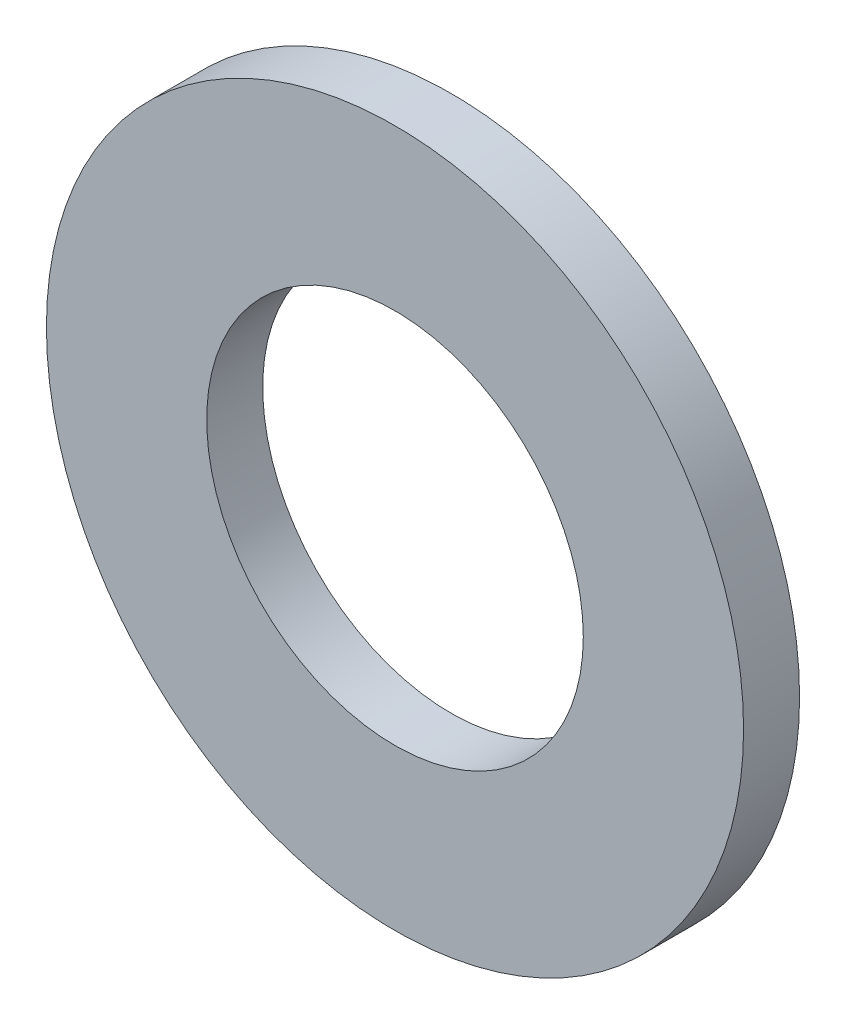
ISO-10303-21;
HEADER;
FILE_DESCRIPTION(('STEP AP214'),'2;1');
FILE_NAME('part.step','',(''),(''),'','','');
FILE_SCHEMA(('AUTOMOTIVE_DESIGN { 1 0 10303 214 1 1 1 1 }'));
ENDSEC;
DATA;
#1=APPLICATION_CONTEXT('core data for automotive mechanical design processes');
#2=APPLICATION_PROTOCOL_DEFINITION('international standard','automotive_design',2000,#1);
#3=PRODUCT_CONTEXT('',#1,'mechanical');
#4=PRODUCT('Part','Part','',(#3));
#5=PRODUCT_RELATED_PRODUCT_CATEGORY('part','',(#4));
#6=PRODUCT_DEFINITION_FORMATION('','',#4);
#7=PRODUCT_DEFINITION_CONTEXT('part definition',#1,'design');
#8=PRODUCT_DEFINITION('design','',#6,#7);
#9=PRODUCT_DEFINITION_SHAPE('','',#8);
#10=(LENGTH_UNIT() NAMED_UNIT(*) SI_UNIT(.MILLI.,.METRE.));
#11=(NAMED_UNIT(*) PLANE_ANGLE_UNIT() SI_UNIT($,.RADIAN.));
#12=(NAMED_UNIT(*) SI_UNIT($,.STERADIAN.) SOLID_ANGLE_UNIT());
#13=UNCERTAINTY_MEASURE_WITH_UNIT(LENGTH_MEASURE(1.E-05),#10,'distance_accuracy_value','');
#14=(GEOMETRIC_REPRESENTATION_CONTEXT(3) GLOBAL_UNCERTAINTY_ASSIGNED_CONTEXT((#13)) GLOBAL_UNIT_ASSIGNED_CONTEXT((#10,
#11,#12)) REPRESENTATION_CONTEXT('',''));
#15=CARTESIAN_POINT('',(0.,0.,0.));
#16=DIRECTION('',(0.,0.,1.));
#17=DIRECTION('',(1.,0.,0.));
#18=AXIS2_PLACEMENT_3D('',#15,#16,#17);
#19=CARTESIAN_POINT('',(0.,0.,1.016));
#20=DIRECTION('',(0.,0.,1.));
#21=DIRECTION('',(1.,0.,0.));
#22=AXIS2_PLACEMENT_3D('',#19,#20,#21);
#23=PLANE('',#22);
#24=CARTESIAN_POINT('',(0.,0.,1.016));
#25=DIRECTION('',(0.,0.,1.));
#26=DIRECTION('',(1.,0.,0.));
#27=AXIS2_PLACEMENT_3D('',#24,#25,#26);
#28=CIRCLE('',#27,6.3246);
#29=CARTESIAN_POINT('',(6.3246,0.,1.016));
#30=VERTEX_POINT('',#29);
#31=EDGE_CURVE('E10',#30,#30,#28,.T.);
#32=ORIENTED_EDGE('',*,*,#31,.T.);
#33=EDGE_LOOP('',(#32));
#34=FACE_BOUND('',#33,.T.);
#35=CARTESIAN_POINT('',(0.,0.,1.016));
#36=DIRECTION('',(0.,0.,1.));
#37=DIRECTION('',(1.,0.,0.));
#38=AXIS2_PLACEMENT_3D('',#35,#36,#37);
#39=CIRCLE('',#38,3.4163);
#40=CARTESIAN_POINT('',(3.4163,0.,1.016));
#41=VERTEX_POINT('',#40);
#42=EDGE_CURVE('E52',#41,#41,#39,.T.);
#43=ORIENTED_EDGE('',*,*,#42,.F.);
#44=EDGE_LOOP('',(#43));
#45=FACE_BOUND('',#44,.T.);
#46=ADVANCED_FACE('F41',(#34,#45),#23,.T.);
#47=CARTESIAN_POINT('',(0.,0.,0.));
#48=DIRECTION('',(0.,0.,1.));
#49=DIRECTION('',(1.,0.,0.));
#50=AXIS2_PLACEMENT_3D('',#47,#48,#49);
#51=PLANE('',#50);
#52=CARTESIAN_POINT('',(0.,0.,0.));
#53=DIRECTION('',(0.,0.,1.));
#54=DIRECTION('',(1.,0.,0.));
#55=AXIS2_PLACEMENT_3D('',#52,#53,#54);
#56=CIRCLE('',#55,6.3246);
#57=CARTESIAN_POINT('',(6.3246,0.,0.));
#58=VERTEX_POINT('',#57);
#59=EDGE_CURVE('E48',#58,#58,#56,.T.);
#60=ORIENTED_EDGE('',*,*,#59,.F.);
#61=EDGE_LOOP('',(#60));
#62=FACE_BOUND('',#61,.T.);
#63=CARTESIAN_POINT('',(0.,0.,0.));
#64=DIRECTION('',(0.,0.,1.));
#65=DIRECTION('',(1.,0.,0.));
#66=AXIS2_PLACEMENT_3D('',#63,#64,#65);
#67=CIRCLE('',#66,3.4163);
#68=CARTESIAN_POINT('',(3.4163,0.,0.));
#69=VERTEX_POINT('',#68);
#70=EDGE_CURVE('E56',#69,#69,#67,.T.);
#71=ORIENTED_EDGE('',*,*,#70,.T.);
#72=EDGE_LOOP('',(#71));
#73=FACE_BOUND('',#72,.T.);
#74=ADVANCED_FACE('F62',(#62,#73),#51,.F.);
#75=CARTESIAN_POINT('',(0.,0.,1.016));
#76=DIRECTION('',(0.,0.,-1.));
#77=DIRECTION('',(-1.,0.,0.));
#78=AXIS2_PLACEMENT_3D('',#75,#76,#77);
#79=CYLINDRICAL_SURFACE('',#78,6.3246);
#80=ORIENTED_EDGE('',*,*,#31,.F.);
#81=EDGE_LOOP('',(#80));
#82=FACE_BOUND('',#81,.T.);
#83=ORIENTED_EDGE('',*,*,#59,.T.);
#84=EDGE_LOOP('',(#83));
#85=FACE_BOUND('',#84,.T.);
#86=ADVANCED_FACE('F43',(#82,#85),#79,.T.);
#87=CARTESIAN_POINT('',(0.,0.,1.016));
#88=DIRECTION('',(0.,0.,-1.));
#89=DIRECTION('',(-1.,0.,0.));
#90=AXIS2_PLACEMENT_3D('',#87,#88,#89);
#91=CYLINDRICAL_SURFACE('',#90,3.4163);
#92=ORIENTED_EDGE('',*,*,#42,.T.);
#93=EDGE_LOOP('',(#92));
#94=FACE_BOUND('',#93,.T.);
#95=ORIENTED_EDGE('',*,*,#70,.F.);
#96=EDGE_LOOP('',(#95));
#97=FACE_BOUND('',#96,.T.);
#98=ADVANCED_FACE('F64',(#94,#97),#91,.F.);
#99=CLOSED_SHELL('',(#46,#74,#86,#98));
#100=MANIFOLD_SOLID_BREP('B2',#99);
#101=ADVANCED_BREP_SHAPE_REPRESENTATION('',(#18,#100),#14);
#102=SHAPE_DEFINITION_REPRESENTATION(#9,#101);
ENDSEC;
END-ISO-10303-21;
